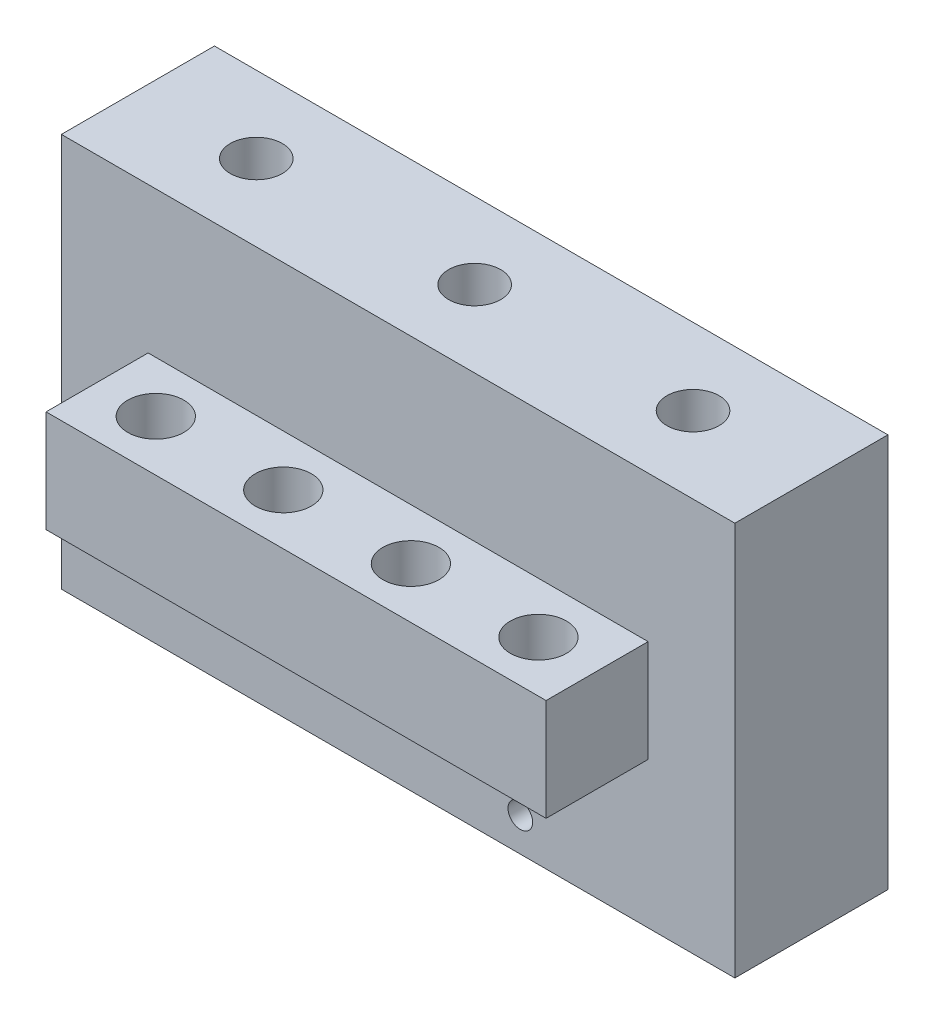
ISO-10303-21;
HEADER;
FILE_DESCRIPTION(('STEP AP214'),'2;1');
FILE_NAME('part.step','',(''),(''),'','','');
FILE_SCHEMA(('AUTOMOTIVE_DESIGN { 1 0 10303 214 1 1 1 1 }'));
ENDSEC;
DATA;
#1=APPLICATION_CONTEXT('core data for automotive mechanical design processes');
#2=APPLICATION_PROTOCOL_DEFINITION('international standard','automotive_design',2000,#1);
#3=PRODUCT_CONTEXT('',#1,'mechanical');
#4=PRODUCT('Part','Part','',(#3));
#5=PRODUCT_RELATED_PRODUCT_CATEGORY('part','',(#4));
#6=PRODUCT_DEFINITION_FORMATION('','',#4);
#7=PRODUCT_DEFINITION_CONTEXT('part definition',#1,'design');
#8=PRODUCT_DEFINITION('design','',#6,#7);
#9=PRODUCT_DEFINITION_SHAPE('','',#8);
#10=(LENGTH_UNIT() NAMED_UNIT(*) SI_UNIT(.MILLI.,.METRE.));
#11=(NAMED_UNIT(*) PLANE_ANGLE_UNIT() SI_UNIT($,.RADIAN.));
#12=(NAMED_UNIT(*) SI_UNIT($,.STERADIAN.) SOLID_ANGLE_UNIT());
#13=UNCERTAINTY_MEASURE_WITH_UNIT(LENGTH_MEASURE(1.E-05),#10,'distance_accuracy_value','');
#14=(GEOMETRIC_REPRESENTATION_CONTEXT(3) GLOBAL_UNCERTAINTY_ASSIGNED_CONTEXT((#13)) GLOBAL_UNIT_ASSIGNED_CONTEXT((#10,
#11,#12)) REPRESENTATION_CONTEXT('',''));
#15=CARTESIAN_POINT('',(0.,0.,0.));
#16=DIRECTION('',(0.,0.,1.));
#17=DIRECTION('',(1.,0.,0.));
#18=AXIS2_PLACEMENT_3D('',#15,#16,#17);
#19=CARTESIAN_POINT('',(24.5,10.,0.));
#20=DIRECTION('',(-1.,0.,0.));
#21=DIRECTION('',(0.,0.,1.));
#22=AXIS2_PLACEMENT_3D('',#19,#20,#21);
#23=PLANE('',#22);
#24=DIRECTION('',(0.,0.,-1.));
#25=VECTOR('',#24,1.);
#26=CARTESIAN_POINT('',(24.5,0.,0.));
#27=LINE('',#26,#25);
#28=CARTESIAN_POINT('',(24.5,0.,0.));
#29=VERTEX_POINT('',#28);
#30=CARTESIAN_POINT('',(24.5,0.,-10.));
#31=VERTEX_POINT('',#30);
#32=EDGE_CURVE('E159',#29,#31,#27,.T.);
#33=ORIENTED_EDGE('',*,*,#32,.T.);
#34=DIRECTION('',(0.,-1.,0.));
#35=VECTOR('',#34,1.);
#36=CARTESIAN_POINT('',(24.5,10.,-10.));
#37=LINE('',#36,#35);
#38=CARTESIAN_POINT('',(24.5,10.,-10.));
#39=VERTEX_POINT('',#38);
#40=EDGE_CURVE('E11',#39,#31,#37,.T.);
#41=ORIENTED_EDGE('',*,*,#40,.F.);
#42=DIRECTION('',(0.,0.,-1.));
#43=VECTOR('',#42,1.);
#44=CARTESIAN_POINT('',(24.5,10.,0.));
#45=LINE('',#44,#43);
#46=CARTESIAN_POINT('',(24.5,10.,0.));
#47=VERTEX_POINT('',#46);
#48=EDGE_CURVE('E78',#47,#39,#45,.T.);
#49=ORIENTED_EDGE('',*,*,#48,.F.);
#50=DIRECTION('',(0.,-1.,0.));
#51=VECTOR('',#50,1.);
#52=CARTESIAN_POINT('',(24.5,10.,0.));
#53=LINE('',#52,#51);
#54=EDGE_CURVE('E55',#47,#29,#53,.T.);
#55=ORIENTED_EDGE('',*,*,#54,.T.);
#56=EDGE_LOOP('',(#33,#41,#49,#55));
#57=FACE_BOUND('',#56,.T.);
#58=ADVANCED_FACE('F38',(#57),#23,.F.);
#59=CARTESIAN_POINT('',(-24.5,10.,0.));
#60=DIRECTION('',(-1.,0.,0.));
#61=DIRECTION('',(0.,0.,1.));
#62=AXIS2_PLACEMENT_3D('',#59,#60,#61);
#63=PLANE('',#62);
#64=DIRECTION('',(0.,0.,-1.));
#65=VECTOR('',#64,1.);
#66=CARTESIAN_POINT('',(-24.5,0.,0.));
#67=LINE('',#66,#65);
#68=CARTESIAN_POINT('',(-24.5,0.,0.));
#69=VERTEX_POINT('',#68);
#70=CARTESIAN_POINT('',(-24.5,0.,-10.));
#71=VERTEX_POINT('',#70);
#72=EDGE_CURVE('E193',#69,#71,#67,.T.);
#73=ORIENTED_EDGE('',*,*,#72,.F.);
#74=DIRECTION('',(0.,-1.,0.));
#75=VECTOR('',#74,1.);
#76=CARTESIAN_POINT('',(-24.5,10.,0.));
#77=LINE('',#76,#75);
#78=CARTESIAN_POINT('',(-24.5,10.,0.));
#79=VERTEX_POINT('',#78);
#80=EDGE_CURVE('E67',#79,#69,#77,.T.);
#81=ORIENTED_EDGE('',*,*,#80,.F.);
#82=DIRECTION('',(0.,0.,-1.));
#83=VECTOR('',#82,1.);
#84=CARTESIAN_POINT('',(-24.5,10.,0.));
#85=LINE('',#84,#83);
#86=CARTESIAN_POINT('',(-24.5,10.,-10.));
#87=VERTEX_POINT('',#86);
#88=EDGE_CURVE('E185',#79,#87,#85,.T.);
#89=ORIENTED_EDGE('',*,*,#88,.T.);
#90=DIRECTION('',(0.,-1.,0.));
#91=VECTOR('',#90,1.);
#92=CARTESIAN_POINT('',(-24.5,10.,-10.));
#93=LINE('',#92,#91);
#94=EDGE_CURVE('E47',#87,#71,#93,.T.);
#95=ORIENTED_EDGE('',*,*,#94,.T.);
#96=EDGE_LOOP('',(#73,#81,#89,#95));
#97=FACE_BOUND('',#96,.T.);
#98=ADVANCED_FACE('F202',(#97),#63,.T.);
#99=CARTESIAN_POINT('',(24.5,10.,0.));
#100=DIRECTION('',(0.,0.,1.));
#101=DIRECTION('',(1.,0.,0.));
#102=AXIS2_PLACEMENT_3D('',#99,#100,#101);
#103=PLANE('',#102);
#104=DIRECTION('',(-1.,0.,0.));
#105=VECTOR('',#104,1.);
#106=CARTESIAN_POINT('',(24.5,0.,0.));
#107=LINE('',#106,#105);
#108=EDGE_CURVE('E182',#29,#69,#107,.T.);
#109=ORIENTED_EDGE('',*,*,#108,.F.);
#110=ORIENTED_EDGE('',*,*,#54,.F.);
#111=DIRECTION('',(-1.,0.,0.));
#112=VECTOR('',#111,1.);
#113=CARTESIAN_POINT('',(24.5,10.,0.));
#114=LINE('',#113,#112);
#115=EDGE_CURVE('E188',#47,#79,#114,.T.);
#116=ORIENTED_EDGE('',*,*,#115,.T.);
#117=ORIENTED_EDGE('',*,*,#80,.T.);
#118=EDGE_LOOP('',(#109,#110,#116,#117));
#119=FACE_BOUND('',#118,.T.);
#120=ADVANCED_FACE('F210',(#119),#103,.T.);
#121=CARTESIAN_POINT('',(0.,10.,0.));
#122=DIRECTION('',(0.,-1.,0.));
#123=DIRECTION('',(0.,0.,-1.));
#124=AXIS2_PLACEMENT_3D('',#121,#122,#123);
#125=PLANE('',#124);
#126=CARTESIAN_POINT('',(-18.75,10.,-5.));
#127=DIRECTION('',(0.,1.,0.));
#128=DIRECTION('',(0.,0.,1.));
#129=AXIS2_PLACEMENT_3D('',#126,#127,#128);
#130=CIRCLE('',#129,2.75);
#131=CARTESIAN_POINT('',(-18.75,10.,-2.25));
#132=VERTEX_POINT('',#131);
#133=EDGE_CURVE('E160',#132,#132,#130,.T.);
#134=ORIENTED_EDGE('',*,*,#133,.F.);
#135=EDGE_LOOP('',(#134));
#136=FACE_BOUND('',#135,.T.);
#137=CARTESIAN_POINT('',(-6.25,10.,-5.));
#138=DIRECTION('',(0.,1.,0.));
#139=DIRECTION('',(0.,0.,1.));
#140=AXIS2_PLACEMENT_3D('',#137,#138,#139);
#141=CIRCLE('',#140,2.75);
#142=CARTESIAN_POINT('',(-6.25,10.,-2.25));
#143=VERTEX_POINT('',#142);
#144=EDGE_CURVE('E166',#143,#143,#141,.T.);
#145=ORIENTED_EDGE('',*,*,#144,.F.);
#146=EDGE_LOOP('',(#145));
#147=FACE_BOUND('',#146,.T.);
#148=CARTESIAN_POINT('',(6.25,10.,-5.));
#149=DIRECTION('',(0.,1.,0.));
#150=DIRECTION('',(0.,0.,1.));
#151=AXIS2_PLACEMENT_3D('',#148,#149,#150);
#152=CIRCLE('',#151,2.75);
#153=CARTESIAN_POINT('',(6.25,10.,-2.25));
#154=VERTEX_POINT('',#153);
#155=EDGE_CURVE('E172',#154,#154,#152,.T.);
#156=ORIENTED_EDGE('',*,*,#155,.F.);
#157=EDGE_LOOP('',(#156));
#158=FACE_BOUND('',#157,.T.);
#159=CARTESIAN_POINT('',(18.75,10.,-5.));
#160=DIRECTION('',(0.,1.,0.));
#161=DIRECTION('',(0.,0.,1.));
#162=AXIS2_PLACEMENT_3D('',#159,#160,#161);
#163=CIRCLE('',#162,2.75);
#164=CARTESIAN_POINT('',(18.75,10.,-2.25));
#165=VERTEX_POINT('',#164);
#166=EDGE_CURVE('E153',#165,#165,#163,.T.);
#167=ORIENTED_EDGE('',*,*,#166,.F.);
#168=EDGE_LOOP('',(#167));
#169=FACE_BOUND('',#168,.T.);
#170=ORIENTED_EDGE('',*,*,#48,.T.);
#171=DIRECTION('',(1.,0.,0.));
#172=VECTOR('',#171,1.);
#173=CARTESIAN_POINT('',(-24.5,10.,-10.));
#174=LINE('',#173,#172);
#175=EDGE_CURVE('E181',#87,#39,#174,.T.);
#176=ORIENTED_EDGE('',*,*,#175,.F.);
#177=ORIENTED_EDGE('',*,*,#88,.F.);
#178=ORIENTED_EDGE('',*,*,#115,.F.);
#179=EDGE_LOOP('',(#170,#176,#177,#178));
#180=FACE_BOUND('',#179,.T.);
#181=ADVANCED_FACE('F212',(#136,#147,#158,#169,#180),#125,.F.);
#182=CARTESIAN_POINT('',(0.,0.,0.));
#183=DIRECTION('',(0.,-1.,0.));
#184=DIRECTION('',(0.,0.,-1.));
#185=AXIS2_PLACEMENT_3D('',#182,#183,#184);
#186=PLANE('',#185);
#187=CARTESIAN_POINT('',(-18.75,0.,-5.));
#188=DIRECTION('',(0.,1.,0.));
#189=DIRECTION('',(0.,0.,1.));
#190=AXIS2_PLACEMENT_3D('',#187,#188,#189);
#191=CIRCLE('',#190,2.75);
#192=CARTESIAN_POINT('',(-18.75,0.,-2.25));
#193=VERTEX_POINT('',#192);
#194=EDGE_CURVE('E156',#193,#193,#191,.T.);
#195=ORIENTED_EDGE('',*,*,#194,.T.);
#196=EDGE_LOOP('',(#195));
#197=FACE_BOUND('',#196,.T.);
#198=CARTESIAN_POINT('',(-6.25,0.,-5.));
#199=DIRECTION('',(0.,1.,0.));
#200=DIRECTION('',(0.,0.,1.));
#201=AXIS2_PLACEMENT_3D('',#198,#199,#200);
#202=CIRCLE('',#201,2.75);
#203=CARTESIAN_POINT('',(-6.25,0.,-2.25));
#204=VERTEX_POINT('',#203);
#205=EDGE_CURVE('E163',#204,#204,#202,.T.);
#206=ORIENTED_EDGE('',*,*,#205,.T.);
#207=EDGE_LOOP('',(#206));
#208=FACE_BOUND('',#207,.T.);
#209=CARTESIAN_POINT('',(6.25,0.,-5.));
#210=DIRECTION('',(0.,1.,0.));
#211=DIRECTION('',(0.,0.,1.));
#212=AXIS2_PLACEMENT_3D('',#209,#210,#211);
#213=CIRCLE('',#212,2.75);
#214=CARTESIAN_POINT('',(6.25,0.,-2.25));
#215=VERTEX_POINT('',#214);
#216=EDGE_CURVE('E169',#215,#215,#213,.T.);
#217=ORIENTED_EDGE('',*,*,#216,.T.);
#218=EDGE_LOOP('',(#217));
#219=FACE_BOUND('',#218,.T.);
#220=CARTESIAN_POINT('',(18.75,0.,-5.));
#221=DIRECTION('',(0.,1.,0.));
#222=DIRECTION('',(0.,0.,1.));
#223=AXIS2_PLACEMENT_3D('',#220,#221,#222);
#224=CIRCLE('',#223,2.75);
#225=CARTESIAN_POINT('',(18.75,0.,-2.25));
#226=VERTEX_POINT('',#225);
#227=EDGE_CURVE('E175',#226,#226,#224,.T.);
#228=ORIENTED_EDGE('',*,*,#227,.T.);
#229=EDGE_LOOP('',(#228));
#230=FACE_BOUND('',#229,.T.);
#231=ORIENTED_EDGE('',*,*,#32,.F.);
#232=ORIENTED_EDGE('',*,*,#108,.T.);
#233=ORIENTED_EDGE('',*,*,#72,.T.);
#234=DIRECTION('',(1.,0.,0.));
#235=VECTOR('',#234,1.);
#236=CARTESIAN_POINT('',(-24.5,0.,-10.));
#237=LINE('',#236,#235);
#238=EDGE_CURVE('E191',#71,#31,#237,.T.);
#239=ORIENTED_EDGE('',*,*,#238,.T.);
#240=EDGE_LOOP('',(#231,#232,#233,#239));
#241=FACE_BOUND('',#240,.T.);
#242=ADVANCED_FACE('F207',(#197,#208,#219,#230,#241),#186,.T.);
#243=CARTESIAN_POINT('',(18.75,0.,-5.));
#244=DIRECTION('',(0.,1.,0.));
#245=DIRECTION('',(0.,0.,1.));
#246=AXIS2_PLACEMENT_3D('',#243,#244,#245);
#247=CYLINDRICAL_SURFACE('',#246,2.75);
#248=ORIENTED_EDGE('',*,*,#227,.F.);
#249=EDGE_LOOP('',(#248));
#250=FACE_BOUND('',#249,.T.);
#251=ORIENTED_EDGE('',*,*,#166,.T.);
#252=EDGE_LOOP('',(#251));
#253=FACE_BOUND('',#252,.T.);
#254=ADVANCED_FACE('F245',(#250,#253),#247,.F.);
#255=CARTESIAN_POINT('',(6.25,0.,-5.));
#256=DIRECTION('',(0.,1.,0.));
#257=DIRECTION('',(0.,0.,1.));
#258=AXIS2_PLACEMENT_3D('',#255,#256,#257);
#259=CYLINDRICAL_SURFACE('',#258,2.75);
#260=ORIENTED_EDGE('',*,*,#216,.F.);
#261=EDGE_LOOP('',(#260));
#262=FACE_BOUND('',#261,.T.);
#263=ORIENTED_EDGE('',*,*,#155,.T.);
#264=EDGE_LOOP('',(#263));
#265=FACE_BOUND('',#264,.T.);
#266=ADVANCED_FACE('F401',(#262,#265),#259,.F.);
#267=CARTESIAN_POINT('',(-6.25,0.,-5.));
#268=DIRECTION('',(0.,1.,0.));
#269=DIRECTION('',(0.,0.,1.));
#270=AXIS2_PLACEMENT_3D('',#267,#268,#269);
#271=CYLINDRICAL_SURFACE('',#270,2.75);
#272=ORIENTED_EDGE('',*,*,#205,.F.);
#273=EDGE_LOOP('',(#272));
#274=FACE_BOUND('',#273,.T.);
#275=ORIENTED_EDGE('',*,*,#144,.T.);
#276=EDGE_LOOP('',(#275));
#277=FACE_BOUND('',#276,.T.);
#278=ADVANCED_FACE('F397',(#274,#277),#271,.F.);
#279=CARTESIAN_POINT('',(-18.75,0.,-5.));
#280=DIRECTION('',(0.,1.,0.));
#281=DIRECTION('',(0.,0.,1.));
#282=AXIS2_PLACEMENT_3D('',#279,#280,#281);
#283=CYLINDRICAL_SURFACE('',#282,2.75);
#284=ORIENTED_EDGE('',*,*,#194,.F.);
#285=EDGE_LOOP('',(#284));
#286=FACE_BOUND('',#285,.T.);
#287=ORIENTED_EDGE('',*,*,#133,.T.);
#288=EDGE_LOOP('',(#287));
#289=FACE_BOUND('',#288,.T.);
#290=ADVANCED_FACE('F257',(#286,#289),#283,.F.);
#291=CARTESIAN_POINT('',(-33.,0.,-25.));
#292=DIRECTION('',(-1.,0.,0.));
#293=DIRECTION('',(0.,0.,1.));
#294=AXIS2_PLACEMENT_3D('',#291,#292,#293);
#295=PLANE('',#294);
#296=DIRECTION('',(0.,-1.,0.));
#297=VECTOR('',#296,1.);
#298=CARTESIAN_POINT('',(-33.,0.,-10.));
#299=LINE('',#298,#297);
#300=CARTESIAN_POINT('',(-33.,24.2999999988113,-10.));
#301=VERTEX_POINT('',#300);
#302=CARTESIAN_POINT('',(-33.,-14.3000000011886,-10.));
#303=VERTEX_POINT('',#302);
#304=EDGE_CURVE('E125',#301,#303,#299,.T.);
#305=ORIENTED_EDGE('',*,*,#304,.F.);
#306=DIRECTION('',(0.,0.,-1.));
#307=VECTOR('',#306,1.);
#308=CARTESIAN_POINT('',(-33.,24.2999999988113,56.3493782941194));
#309=LINE('',#308,#307);
#310=CARTESIAN_POINT('',(-33.,24.2999999988113,-25.));
#311=VERTEX_POINT('',#310);
#312=EDGE_CURVE('E123',#301,#311,#309,.T.);
#313=ORIENTED_EDGE('',*,*,#312,.T.);
#314=DIRECTION('',(0.,-1.,0.));
#315=VECTOR('',#314,1.);
#316=CARTESIAN_POINT('',(-33.,0.,-25.));
#317=LINE('',#316,#315);
#318=CARTESIAN_POINT('',(-33.,-14.3000000011886,-25.));
#319=VERTEX_POINT('',#318);
#320=EDGE_CURVE('E109',#311,#319,#317,.T.);
#321=ORIENTED_EDGE('',*,*,#320,.T.);
#322=DIRECTION('',(0.,0.,-1.));
#323=VECTOR('',#322,1.);
#324=CARTESIAN_POINT('',(-33.,-14.3000000011886,56.3493782941194));
#325=LINE('',#324,#323);
#326=EDGE_CURVE('E146',#303,#319,#325,.T.);
#327=ORIENTED_EDGE('',*,*,#326,.F.);
#328=EDGE_LOOP('',(#305,#313,#321,#327));
#329=FACE_BOUND('',#328,.T.);
#330=ADVANCED_FACE('F124',(#329),#295,.T.);
#331=CARTESIAN_POINT('',(33.,0.,-25.));
#332=DIRECTION('',(-1.,0.,0.));
#333=DIRECTION('',(0.,0.,1.));
#334=AXIS2_PLACEMENT_3D('',#331,#332,#333);
#335=PLANE('',#334);
#336=DIRECTION('',(0.,-1.,0.));
#337=VECTOR('',#336,1.);
#338=CARTESIAN_POINT('',(33.,0.,-10.));
#339=LINE('',#338,#337);
#340=CARTESIAN_POINT('',(33.,24.2999999988114,-10.));
#341=VERTEX_POINT('',#340);
#342=CARTESIAN_POINT('',(33.,-14.3000000011886,-10.));
#343=VERTEX_POINT('',#342);
#344=EDGE_CURVE('E120',#341,#343,#339,.T.);
#345=ORIENTED_EDGE('',*,*,#344,.T.);
#346=DIRECTION('',(0.,0.,-1.));
#347=VECTOR('',#346,1.);
#348=CARTESIAN_POINT('',(33.,-14.3000000011886,56.3493782941194));
#349=LINE('',#348,#347);
#350=CARTESIAN_POINT('',(33.,-14.3000000011886,-25.));
#351=VERTEX_POINT('',#350);
#352=EDGE_CURVE('E148',#343,#351,#349,.T.);
#353=ORIENTED_EDGE('',*,*,#352,.T.);
#354=DIRECTION('',(0.,-1.,0.));
#355=VECTOR('',#354,1.);
#356=CARTESIAN_POINT('',(33.,0.,-25.));
#357=LINE('',#356,#355);
#358=CARTESIAN_POINT('',(33.,24.2999999988113,-25.));
#359=VERTEX_POINT('',#358);
#360=EDGE_CURVE('E119',#359,#351,#357,.T.);
#361=ORIENTED_EDGE('',*,*,#360,.F.);
#362=DIRECTION('',(0.,0.,-1.));
#363=VECTOR('',#362,1.);
#364=CARTESIAN_POINT('',(33.,24.2999999988113,56.3493782941194));
#365=LINE('',#364,#363);
#366=EDGE_CURVE('E129',#341,#359,#365,.T.);
#367=ORIENTED_EDGE('',*,*,#366,.F.);
#368=EDGE_LOOP('',(#345,#353,#361,#367));
#369=FACE_BOUND('',#368,.T.);
#370=ADVANCED_FACE('F256',(#369),#335,.F.);
#371=CARTESIAN_POINT('',(0.,0.,-25.));
#372=DIRECTION('',(0.,0.,-1.));
#373=DIRECTION('',(-1.,0.,0.));
#374=AXIS2_PLACEMENT_3D('',#371,#372,#373);
#375=PLANE('',#374);
#376=CARTESIAN_POINT('',(11.9761,-11.0000000011886,-25.));
#377=DIRECTION('',(0.,0.,-1.));
#378=DIRECTION('',(-1.,0.,0.));
#379=AXIS2_PLACEMENT_3D('',#376,#377,#378);
#380=ELLIPSE('',#379,1.2065,1.20586704213638);
#381=CARTESIAN_POINT('',(10.7696,-11.0000000011886,-25.));
#382=VERTEX_POINT('',#381);
#383=EDGE_CURVE('E361',#382,#382,#380,.T.);
#384=ORIENTED_EDGE('',*,*,#383,.F.);
#385=EDGE_LOOP('',(#384));
#386=FACE_BOUND('',#385,.T.);
#387=ORIENTED_EDGE('',*,*,#360,.T.);
#388=DIRECTION('',(1.,0.,0.));
#389=VECTOR('',#388,1.);
#390=CARTESIAN_POINT('',(0.,-14.3000000011886,-25.));
#391=LINE('',#390,#389);
#392=EDGE_CURVE('E115',#319,#351,#391,.T.);
#393=ORIENTED_EDGE('',*,*,#392,.F.);
#394=ORIENTED_EDGE('',*,*,#320,.F.);
#395=DIRECTION('',(-1.,0.,0.));
#396=VECTOR('',#395,1.);
#397=CARTESIAN_POINT('',(0.,24.2999999988114,-25.));
#398=LINE('',#397,#396);
#399=EDGE_CURVE('E113',#359,#311,#398,.T.);
#400=ORIENTED_EDGE('',*,*,#399,.F.);
#401=EDGE_LOOP('',(#387,#393,#394,#400));
#402=FACE_BOUND('',#401,.T.);
#403=ADVANCED_FACE('F111',(#386,#402),#375,.T.);
#404=CARTESIAN_POINT('',(0.,0.,-10.));
#405=DIRECTION('',(0.,0.,-1.));
#406=DIRECTION('',(-1.,0.,0.));
#407=AXIS2_PLACEMENT_3D('',#404,#405,#406);
#408=PLANE('',#407);
#409=CARTESIAN_POINT('',(11.9761,-11.0000000011886,-10.));
#410=DIRECTION('',(0.,0.,-1.));
#411=DIRECTION('',(-1.,0.,0.));
#412=AXIS2_PLACEMENT_3D('',#409,#410,#411);
#413=ELLIPSE('',#412,1.2065,1.20586704213638);
#414=CARTESIAN_POINT('',(10.7696,-11.0000000011886,-10.));
#415=VERTEX_POINT('',#414);
#416=EDGE_CURVE('E41',#415,#415,#413,.T.);
#417=ORIENTED_EDGE('',*,*,#416,.T.);
#418=EDGE_LOOP('',(#417));
#419=FACE_BOUND('',#418,.T.);
#420=ORIENTED_EDGE('',*,*,#238,.F.);
#421=ORIENTED_EDGE('',*,*,#94,.F.);
#422=ORIENTED_EDGE('',*,*,#175,.T.);
#423=ORIENTED_EDGE('',*,*,#40,.T.);
#424=EDGE_LOOP('',(#420,#421,#422,#423));
#425=FACE_BOUND('',#424,.T.);
#426=ORIENTED_EDGE('',*,*,#304,.T.);
#427=DIRECTION('',(-1.,0.,0.));
#428=VECTOR('',#427,1.);
#429=CARTESIAN_POINT('',(0.,-14.3000000011886,-10.));
#430=LINE('',#429,#428);
#431=EDGE_CURVE('E143',#343,#303,#430,.T.);
#432=ORIENTED_EDGE('',*,*,#431,.F.);
#433=ORIENTED_EDGE('',*,*,#344,.F.);
#434=DIRECTION('',(1.,0.,0.));
#435=VECTOR('',#434,1.);
#436=CARTESIAN_POINT('',(0.,24.2999999988114,-10.));
#437=LINE('',#436,#435);
#438=EDGE_CURVE('E141',#301,#341,#437,.T.);
#439=ORIENTED_EDGE('',*,*,#438,.F.);
#440=EDGE_LOOP('',(#426,#432,#433,#439));
#441=FACE_BOUND('',#440,.T.);
#442=ADVANCED_FACE('F208',(#419,#425,#441),#408,.F.);
#443=CARTESIAN_POINT('',(0.,-14.3000000011886,56.3493782941194));
#444=DIRECTION('',(0.,1.,0.));
#445=DIRECTION('',(-1.,0.,0.));
#446=AXIS2_PLACEMENT_3D('',#443,#444,#445);
#447=PLANE('',#446);
#448=CARTESIAN_POINT('',(-21.4,-14.3000000011886,-17.5));
#449=DIRECTION('',(0.,-1.,0.));
#450=DIRECTION('',(0.,0.,-1.));
#451=AXIS2_PLACEMENT_3D('',#448,#449,#450);
#452=CIRCLE('',#451,2.55269999999999);
#453=CARTESIAN_POINT('',(-21.4,-14.3000000011886,-20.0527));
#454=VERTEX_POINT('',#453);
#455=EDGE_CURVE('E363',#454,#454,#452,.T.);
#456=ORIENTED_EDGE('',*,*,#455,.F.);
#457=EDGE_LOOP('',(#456));
#458=FACE_BOUND('',#457,.T.);
#459=CARTESIAN_POINT('',(21.4,-14.3000000011886,-17.5));
#460=DIRECTION('',(0.,-1.,0.));
#461=DIRECTION('',(0.,0.,-1.));
#462=AXIS2_PLACEMENT_3D('',#459,#460,#461);
#463=CIRCLE('',#462,2.55269999999999);
#464=CARTESIAN_POINT('',(21.4,-14.3000000011886,-20.0527));
#465=VERTEX_POINT('',#464);
#466=EDGE_CURVE('E369',#465,#465,#463,.T.);
#467=ORIENTED_EDGE('',*,*,#466,.F.);
#468=EDGE_LOOP('',(#467));
#469=FACE_BOUND('',#468,.T.);
#470=CARTESIAN_POINT('',(0.,-14.3000000011886,-17.5));
#471=DIRECTION('',(0.,-1.,0.));
#472=DIRECTION('',(0.,0.,-1.));
#473=AXIS2_PLACEMENT_3D('',#470,#471,#472);
#474=CIRCLE('',#473,2.5527);
#475=CARTESIAN_POINT('',(0.,-14.3000000011886,-20.0527));
#476=VERTEX_POINT('',#475);
#477=EDGE_CURVE('E137',#476,#476,#474,.T.);
#478=ORIENTED_EDGE('',*,*,#477,.F.);
#479=EDGE_LOOP('',(#478));
#480=FACE_BOUND('',#479,.T.);
#481=ORIENTED_EDGE('',*,*,#352,.F.);
#482=ORIENTED_EDGE('',*,*,#431,.T.);
#483=ORIENTED_EDGE('',*,*,#326,.T.);
#484=ORIENTED_EDGE('',*,*,#392,.T.);
#485=EDGE_LOOP('',(#481,#482,#483,#484));
#486=FACE_BOUND('',#485,.T.);
#487=ADVANCED_FACE('F291',(#458,#469,#480,#486),#447,.F.);
#488=CARTESIAN_POINT('',(0.,24.2999999988114,56.3493782941194));
#489=DIRECTION('',(0.,-1.,0.));
#490=DIRECTION('',(1.,0.,0.));
#491=AXIS2_PLACEMENT_3D('',#488,#489,#490);
#492=PLANE('',#491);
#493=CARTESIAN_POINT('',(-21.4,24.2999999988114,-17.5));
#494=DIRECTION('',(0.,-1.,0.));
#495=DIRECTION('',(0.,0.,-1.));
#496=AXIS2_PLACEMENT_3D('',#493,#494,#495);
#497=CIRCLE('',#496,2.55269999999999);
#498=CARTESIAN_POINT('',(-21.4,24.2999999988114,-20.0527));
#499=VERTEX_POINT('',#498);
#500=EDGE_CURVE('E366',#499,#499,#497,.T.);
#501=ORIENTED_EDGE('',*,*,#500,.T.);
#502=EDGE_LOOP('',(#501));
#503=FACE_BOUND('',#502,.T.);
#504=CARTESIAN_POINT('',(21.4,24.2999999988114,-17.5));
#505=DIRECTION('',(0.,-1.,0.));
#506=DIRECTION('',(0.,0.,-1.));
#507=AXIS2_PLACEMENT_3D('',#504,#505,#506);
#508=CIRCLE('',#507,2.55269999999999);
#509=CARTESIAN_POINT('',(21.4,24.2999999988114,-20.0527));
#510=VERTEX_POINT('',#509);
#511=EDGE_CURVE('E372',#510,#510,#508,.T.);
#512=ORIENTED_EDGE('',*,*,#511,.T.);
#513=EDGE_LOOP('',(#512));
#514=FACE_BOUND('',#513,.T.);
#515=CARTESIAN_POINT('',(0.,24.2999999988114,-17.5));
#516=DIRECTION('',(0.,-1.,0.));
#517=DIRECTION('',(0.,0.,-1.));
#518=AXIS2_PLACEMENT_3D('',#515,#516,#517);
#519=CIRCLE('',#518,2.55269999999999);
#520=CARTESIAN_POINT('',(0.,24.2999999988114,-20.0527));
#521=VERTEX_POINT('',#520);
#522=EDGE_CURVE('E134',#521,#521,#519,.T.);
#523=ORIENTED_EDGE('',*,*,#522,.T.);
#524=EDGE_LOOP('',(#523));
#525=FACE_BOUND('',#524,.T.);
#526=ORIENTED_EDGE('',*,*,#312,.F.);
#527=ORIENTED_EDGE('',*,*,#438,.T.);
#528=ORIENTED_EDGE('',*,*,#366,.T.);
#529=ORIENTED_EDGE('',*,*,#399,.T.);
#530=EDGE_LOOP('',(#526,#527,#528,#529));
#531=FACE_BOUND('',#530,.T.);
#532=ADVANCED_FACE('F132',(#503,#514,#525,#531),#492,.F.);
#533=CARTESIAN_POINT('',(0.,-14.3000000011886,-17.5));
#534=DIRECTION('',(0.,-1.,0.));
#535=DIRECTION('',(0.,0.,-1.));
#536=AXIS2_PLACEMENT_3D('',#533,#534,#535);
#537=CYLINDRICAL_SURFACE('',#536,2.55269999999999);
#538=ORIENTED_EDGE('',*,*,#522,.F.);
#539=EDGE_LOOP('',(#538));
#540=FACE_BOUND('',#539,.T.);
#541=ORIENTED_EDGE('',*,*,#477,.T.);
#542=EDGE_LOOP('',(#541));
#543=FACE_BOUND('',#542,.T.);
#544=ADVANCED_FACE('F276',(#540,#543),#537,.F.);
#545=CARTESIAN_POINT('',(21.4,-14.3000000011886,-17.5));
#546=DIRECTION('',(0.,-1.,0.));
#547=DIRECTION('',(0.,0.,-1.));
#548=AXIS2_PLACEMENT_3D('',#545,#546,#547);
#549=CYLINDRICAL_SURFACE('',#548,2.55269999999999);
#550=ORIENTED_EDGE('',*,*,#511,.F.);
#551=EDGE_LOOP('',(#550));
#552=FACE_BOUND('',#551,.T.);
#553=ORIENTED_EDGE('',*,*,#466,.T.);
#554=EDGE_LOOP('',(#553));
#555=FACE_BOUND('',#554,.T.);
#556=ADVANCED_FACE('F281',(#552,#555),#549,.F.);
#557=CARTESIAN_POINT('',(-21.4,-14.3000000011886,-17.5));
#558=DIRECTION('',(0.,-1.,0.));
#559=DIRECTION('',(0.,0.,-1.));
#560=AXIS2_PLACEMENT_3D('',#557,#558,#559);
#561=CYLINDRICAL_SURFACE('',#560,2.55269999999999);
#562=ORIENTED_EDGE('',*,*,#500,.F.);
#563=EDGE_LOOP('',(#562));
#564=FACE_BOUND('',#563,.T.);
#565=ORIENTED_EDGE('',*,*,#455,.T.);
#566=EDGE_LOOP('',(#565));
#567=FACE_BOUND('',#566,.T.);
#568=ADVANCED_FACE('F314',(#564,#567),#561,.F.);
#569=CARTESIAN_POINT('',(11.9761,-11.0000000011886,0.));
#570=DIRECTION('',(0.,0.,-1.));
#571=DIRECTION('',(-1.,0.,0.));
#572=AXIS2_PLACEMENT_3D('',#569,#570,#571);
#573=ELLIPSE('',#572,1.2065,1.20586704213638);
#574=DIRECTION('',(0.,0.,-1.));
#575=VECTOR('',#574,1.);
#576=SURFACE_OF_LINEAR_EXTRUSION('',#573,#575);
#577=ORIENTED_EDGE('',*,*,#383,.T.);
#578=EDGE_LOOP('',(#577));
#579=FACE_BOUND('',#578,.T.);
#580=ORIENTED_EDGE('',*,*,#416,.F.);
#581=EDGE_LOOP('',(#580));
#582=FACE_BOUND('',#581,.T.);
#583=ADVANCED_FACE('F324',(#579,#582),#576,.F.);
#584=CLOSED_SHELL('',(#58,#98,#120,#181,#242,#254,#266,#278,#290,#330,#370,#403,#442,#487,#532,
#544,#556,#568,#583));
#585=MANIFOLD_SOLID_BREP('B2',#584);
#586=ADVANCED_BREP_SHAPE_REPRESENTATION('',(#18,#585),#14);
#587=SHAPE_DEFINITION_REPRESENTATION(#9,#586);
ENDSEC;
END-ISO-10303-21;
